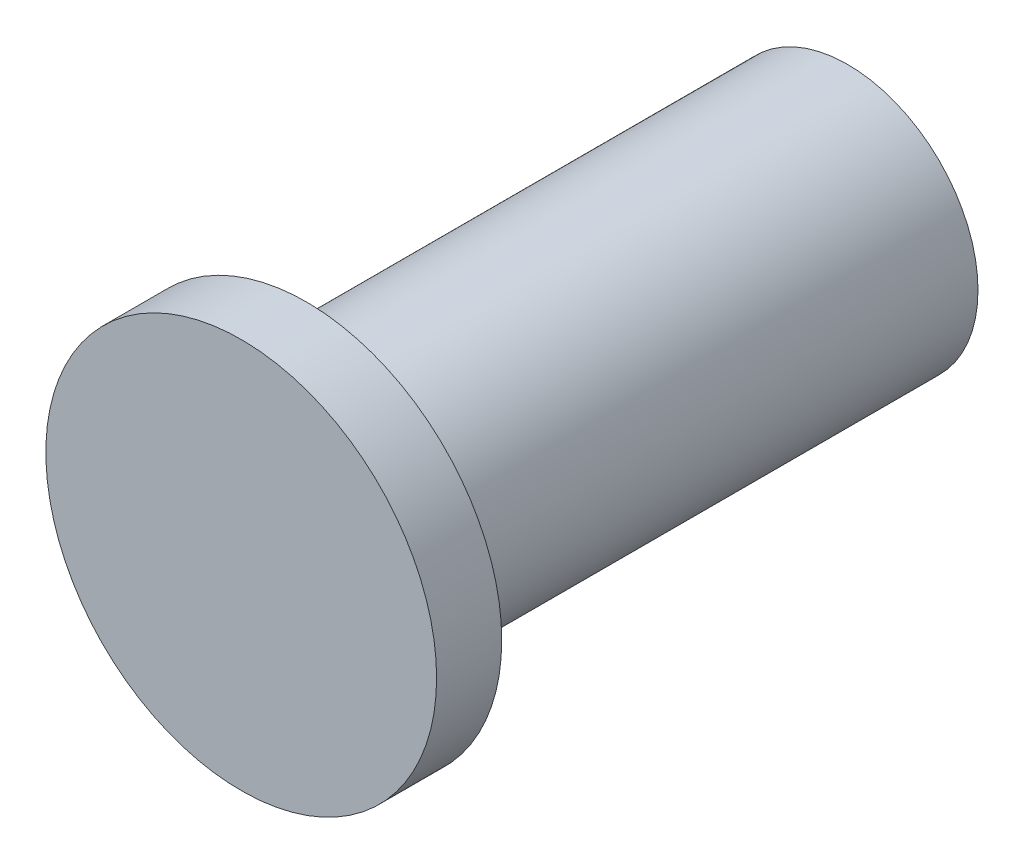
ISO-10303-21;
HEADER;
FILE_DESCRIPTION(('STEP AP214'),'2;1');
FILE_NAME('part.step','',(''),(''),'','','');
FILE_SCHEMA(('AUTOMOTIVE_DESIGN { 1 0 10303 214 1 1 1 1 }'));
ENDSEC;
DATA;
#1=APPLICATION_CONTEXT('core data for automotive mechanical design processes');
#2=APPLICATION_PROTOCOL_DEFINITION('international standard','automotive_design',2000,#1);
#3=PRODUCT_CONTEXT('',#1,'mechanical');
#4=PRODUCT('Part','Part','',(#3));
#5=PRODUCT_RELATED_PRODUCT_CATEGORY('part','',(#4));
#6=PRODUCT_DEFINITION_FORMATION('','',#4);
#7=PRODUCT_DEFINITION_CONTEXT('part definition',#1,'design');
#8=PRODUCT_DEFINITION('design','',#6,#7);
#9=PRODUCT_DEFINITION_SHAPE('','',#8);
#10=(LENGTH_UNIT() NAMED_UNIT(*) SI_UNIT(.MILLI.,.METRE.));
#11=(NAMED_UNIT(*) PLANE_ANGLE_UNIT() SI_UNIT($,.RADIAN.));
#12=(NAMED_UNIT(*) SI_UNIT($,.STERADIAN.) SOLID_ANGLE_UNIT());
#13=UNCERTAINTY_MEASURE_WITH_UNIT(LENGTH_MEASURE(1.E-05),#10,'distance_accuracy_value','');
#14=(GEOMETRIC_REPRESENTATION_CONTEXT(3) GLOBAL_UNCERTAINTY_ASSIGNED_CONTEXT((#13)) GLOBAL_UNIT_ASSIGNED_CONTEXT((#10,
#11,#12)) REPRESENTATION_CONTEXT('',''));
#15=CARTESIAN_POINT('',(0.,0.,0.));
#16=DIRECTION('',(0.,0.,1.));
#17=DIRECTION('',(1.,0.,0.));
#18=AXIS2_PLACEMENT_3D('',#15,#16,#17);
#19=CARTESIAN_POINT('',(0.,0.,-0.625401595784919));
#20=DIRECTION('',(0.,0.,1.));
#21=DIRECTION('',(1.,0.,0.));
#22=AXIS2_PLACEMENT_3D('',#19,#20,#21);
#23=CYLINDRICAL_SURFACE('',#22,4.);
#24=CARTESIAN_POINT('',(0.,0.,-0.625401595784919));
#25=DIRECTION('',(0.,0.,1.));
#26=DIRECTION('',(1.,0.,0.));
#27=AXIS2_PLACEMENT_3D('',#24,#25,#26);
#28=CIRCLE('',#27,4.);
#29=CARTESIAN_POINT('',(4.,0.,-0.625401595784919));
#30=VERTEX_POINT('',#29);
#31=EDGE_CURVE('E10',#30,#30,#28,.T.);
#32=ORIENTED_EDGE('',*,*,#31,.T.);
#33=EDGE_LOOP('',(#32));
#34=FACE_BOUND('',#33,.T.);
#35=CARTESIAN_POINT('',(0.,0.,16.));
#36=DIRECTION('',(0.,0.,1.));
#37=DIRECTION('',(1.,0.,0.));
#38=AXIS2_PLACEMENT_3D('',#35,#36,#37);
#39=CIRCLE('',#38,4.);
#40=CARTESIAN_POINT('',(4.,0.,16.));
#41=VERTEX_POINT('',#40);
#42=EDGE_CURVE('E40',#41,#41,#39,.T.);
#43=ORIENTED_EDGE('',*,*,#42,.F.);
#44=EDGE_LOOP('',(#43));
#45=FACE_BOUND('',#44,.T.);
#46=ADVANCED_FACE('F34',(#34,#45),#23,.T.);
#47=CARTESIAN_POINT('',(0.,0.,-0.625401595784919));
#48=DIRECTION('',(0.,0.,1.));
#49=DIRECTION('',(1.,0.,0.));
#50=AXIS2_PLACEMENT_3D('',#47,#48,#49);
#51=PLANE('',#50);
#52=CARTESIAN_POINT('',(0.,0.,-0.625401595784919));
#53=DIRECTION('',(0.,0.,-1.));
#54=DIRECTION('',(-1.,0.,0.));
#55=AXIS2_PLACEMENT_3D('',#52,#53,#54);
#56=CIRCLE('',#55,3.);
#57=CARTESIAN_POINT('',(-3.,0.,-0.625401595784919));
#58=VERTEX_POINT('',#57);
#59=EDGE_CURVE('E54',#58,#58,#56,.T.);
#60=ORIENTED_EDGE('',*,*,#59,.F.);
#61=EDGE_LOOP('',(#60));
#62=FACE_BOUND('',#61,.T.);
#63=ORIENTED_EDGE('',*,*,#31,.F.);
#64=EDGE_LOOP('',(#63));
#65=FACE_BOUND('',#64,.T.);
#66=ADVANCED_FACE('F69',(#62,#65),#51,.F.);
#67=CARTESIAN_POINT('',(0.,0.,18.));
#68=DIRECTION('',(0.,0.,-1.));
#69=DIRECTION('',(-1.,0.,0.));
#70=AXIS2_PLACEMENT_3D('',#67,#68,#69);
#71=CYLINDRICAL_SURFACE('',#70,6.);
#72=CARTESIAN_POINT('',(0.,0.,18.));
#73=DIRECTION('',(0.,0.,1.));
#74=DIRECTION('',(1.,0.,0.));
#75=AXIS2_PLACEMENT_3D('',#72,#73,#74);
#76=CIRCLE('',#75,6.);
#77=CARTESIAN_POINT('',(6.,0.,18.));
#78=VERTEX_POINT('',#77);
#79=EDGE_CURVE('E44',#78,#78,#76,.T.);
#80=ORIENTED_EDGE('',*,*,#79,.F.);
#81=EDGE_LOOP('',(#80));
#82=FACE_BOUND('',#81,.T.);
#83=CARTESIAN_POINT('',(0.,0.,16.));
#84=DIRECTION('',(0.,0.,1.));
#85=DIRECTION('',(1.,0.,0.));
#86=AXIS2_PLACEMENT_3D('',#83,#84,#85);
#87=CIRCLE('',#86,6.);
#88=CARTESIAN_POINT('',(6.,0.,16.));
#89=VERTEX_POINT('',#88);
#90=EDGE_CURVE('E48',#89,#89,#87,.T.);
#91=ORIENTED_EDGE('',*,*,#90,.T.);
#92=EDGE_LOOP('',(#91));
#93=FACE_BOUND('',#92,.T.);
#94=ADVANCED_FACE('F72',(#82,#93),#71,.T.);
#95=CARTESIAN_POINT('',(0.,0.,18.));
#96=DIRECTION('',(0.,0.,1.));
#97=DIRECTION('',(1.,0.,0.));
#98=AXIS2_PLACEMENT_3D('',#95,#96,#97);
#99=PLANE('',#98);
#100=ORIENTED_EDGE('',*,*,#79,.T.);
#101=EDGE_LOOP('',(#100));
#102=FACE_BOUND('',#101,.T.);
#103=ADVANCED_FACE('F77',(#102),#99,.T.);
#104=CARTESIAN_POINT('',(0.,0.,16.));
#105=DIRECTION('',(0.,0.,1.));
#106=DIRECTION('',(1.,0.,0.));
#107=AXIS2_PLACEMENT_3D('',#104,#105,#106);
#108=PLANE('',#107);
#109=ORIENTED_EDGE('',*,*,#42,.T.);
#110=EDGE_LOOP('',(#109));
#111=FACE_BOUND('',#110,.T.);
#112=ORIENTED_EDGE('',*,*,#90,.F.);
#113=EDGE_LOOP('',(#112));
#114=FACE_BOUND('',#113,.T.);
#115=ADVANCED_FACE('F65',(#111,#114),#108,.F.);
#116=CARTESIAN_POINT('',(0.,0.,15.3745984042151));
#117=DIRECTION('',(0.,0.,-1.));
#118=DIRECTION('',(-1.,0.,0.));
#119=AXIS2_PLACEMENT_3D('',#116,#117,#118);
#120=CYLINDRICAL_SURFACE('',#119,3.);
#121=CARTESIAN_POINT('',(0.,0.,15.3745984042151));
#122=DIRECTION('',(0.,0.,-1.));
#123=DIRECTION('',(-1.,0.,0.));
#124=AXIS2_PLACEMENT_3D('',#121,#122,#123);
#125=CIRCLE('',#124,3.);
#126=CARTESIAN_POINT('',(-3.,0.,15.3745984042151));
#127=VERTEX_POINT('',#126);
#128=EDGE_CURVE('E52',#127,#127,#125,.T.);
#129=ORIENTED_EDGE('',*,*,#128,.F.);
#130=EDGE_LOOP('',(#129));
#131=FACE_BOUND('',#130,.T.);
#132=ORIENTED_EDGE('',*,*,#59,.T.);
#133=EDGE_LOOP('',(#132));
#134=FACE_BOUND('',#133,.T.);
#135=ADVANCED_FACE('F62',(#131,#134),#120,.F.);
#136=CARTESIAN_POINT('',(0.,0.,15.3745984042151));
#137=DIRECTION('',(0.,0.,-1.));
#138=DIRECTION('',(-1.,0.,0.));
#139=AXIS2_PLACEMENT_3D('',#136,#137,#138);
#140=PLANE('',#139);
#141=ORIENTED_EDGE('',*,*,#128,.T.);
#142=EDGE_LOOP('',(#141));
#143=FACE_BOUND('',#142,.T.);
#144=ADVANCED_FACE('F60',(#143),#140,.T.);
#145=CLOSED_SHELL('',(#46,#66,#94,#103,#115,#135,#144));
#146=MANIFOLD_SOLID_BREP('B2',#145);
#147=ADVANCED_BREP_SHAPE_REPRESENTATION('',(#18,#146),#14);
#148=SHAPE_DEFINITION_REPRESENTATION(#9,#147);
ENDSEC;
END-ISO-10303-21;
